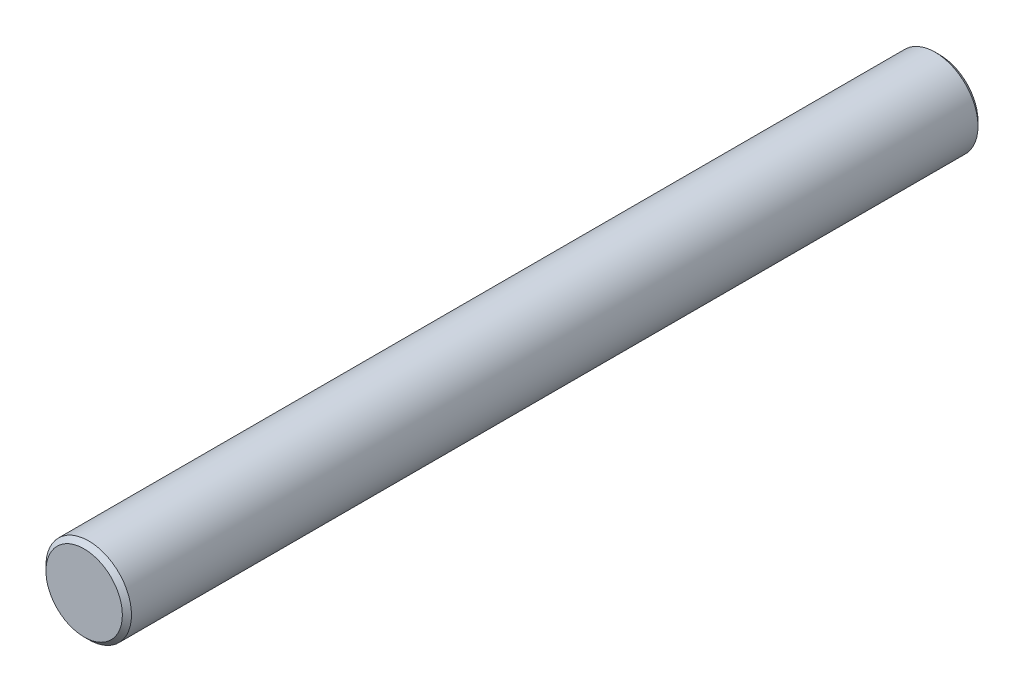
ISO-10303-21;
HEADER;
FILE_DESCRIPTION(('STEP AP214'),'2;1');
FILE_NAME('part.step','',(''),(''),'','','');
FILE_SCHEMA(('AUTOMOTIVE_DESIGN { 1 0 10303 214 1 1 1 1 }'));
ENDSEC;
DATA;
#1=APPLICATION_CONTEXT('core data for automotive mechanical design processes');
#2=APPLICATION_PROTOCOL_DEFINITION('international standard','automotive_design',2000,#1);
#3=PRODUCT_CONTEXT('',#1,'mechanical');
#4=PRODUCT('Part','Part','',(#3));
#5=PRODUCT_RELATED_PRODUCT_CATEGORY('part','',(#4));
#6=PRODUCT_DEFINITION_FORMATION('','',#4);
#7=PRODUCT_DEFINITION_CONTEXT('part definition',#1,'design');
#8=PRODUCT_DEFINITION('design','',#6,#7);
#9=PRODUCT_DEFINITION_SHAPE('','',#8);
#10=(LENGTH_UNIT() NAMED_UNIT(*) SI_UNIT(.MILLI.,.METRE.));
#11=(NAMED_UNIT(*) PLANE_ANGLE_UNIT() SI_UNIT($,.RADIAN.));
#12=(NAMED_UNIT(*) SI_UNIT($,.STERADIAN.) SOLID_ANGLE_UNIT());
#13=UNCERTAINTY_MEASURE_WITH_UNIT(LENGTH_MEASURE(1.E-05),#10,'distance_accuracy_value','');
#14=(GEOMETRIC_REPRESENTATION_CONTEXT(3) GLOBAL_UNCERTAINTY_ASSIGNED_CONTEXT((#13)) GLOBAL_UNIT_ASSIGNED_CONTEXT((#10,
#11,#12)) REPRESENTATION_CONTEXT('',''));
#15=CARTESIAN_POINT('',(0.,0.,0.));
#16=DIRECTION('',(0.,0.,1.));
#17=DIRECTION('',(1.,0.,0.));
#18=AXIS2_PLACEMENT_3D('',#15,#16,#17);
#19=CARTESIAN_POINT('',(0.,0.,95.25));
#20=DIRECTION('',(0.,0.,-1.));
#21=DIRECTION('',(-1.,0.,0.));
#22=AXIS2_PLACEMENT_3D('',#19,#20,#21);
#23=CYLINDRICAL_SURFACE('',#22,4.7625);
#24=CARTESIAN_POINT('',(0.,0.,0.508000000000022));
#25=DIRECTION('',(0.,0.,1.));
#26=DIRECTION('',(1.,0.,0.));
#27=AXIS2_PLACEMENT_3D('',#24,#25,#26);
#28=CIRCLE('',#27,4.7625);
#29=CARTESIAN_POINT('',(4.7625,0.,0.508000000000022));
#30=VERTEX_POINT('',#29);
#31=EDGE_CURVE('E44',#30,#30,#28,.T.);
#32=ORIENTED_EDGE('',*,*,#31,.T.);
#33=EDGE_LOOP('',(#32));
#34=FACE_BOUND('',#33,.T.);
#35=CARTESIAN_POINT('',(0.,0.,94.742));
#36=DIRECTION('',(0.,0.,1.));
#37=DIRECTION('',(1.,0.,0.));
#38=AXIS2_PLACEMENT_3D('',#35,#36,#37);
#39=CIRCLE('',#38,4.7625);
#40=CARTESIAN_POINT('',(4.7625,0.,94.742));
#41=VERTEX_POINT('',#40);
#42=EDGE_CURVE('E48',#41,#41,#39,.F.);
#43=ORIENTED_EDGE('',*,*,#42,.T.);
#44=EDGE_LOOP('',(#43));
#45=FACE_BOUND('',#44,.T.);
#46=ADVANCED_FACE('F32',(#34,#45),#23,.T.);
#47=CARTESIAN_POINT('',(0.,0.,95.25));
#48=DIRECTION('',(0.,0.,1.));
#49=DIRECTION('',(1.,0.,0.));
#50=AXIS2_PLACEMENT_3D('',#47,#48,#49);
#51=PLANE('',#50);
#52=CARTESIAN_POINT('',(0.,0.,95.25));
#53=DIRECTION('',(0.,0.,1.));
#54=DIRECTION('',(1.,0.,0.));
#55=AXIS2_PLACEMENT_3D('',#52,#53,#54);
#56=CIRCLE('',#55,4.25450000000001);
#57=CARTESIAN_POINT('',(4.25450000000001,0.,95.25));
#58=VERTEX_POINT('',#57);
#59=EDGE_CURVE('E10',#58,#58,#56,.T.);
#60=ORIENTED_EDGE('',*,*,#59,.T.);
#61=EDGE_LOOP('',(#60));
#62=FACE_BOUND('',#61,.T.);
#63=ADVANCED_FACE('F64',(#62),#51,.T.);
#64=CARTESIAN_POINT('',(0.,0.,0.));
#65=DIRECTION('',(0.,0.,1.));
#66=DIRECTION('',(1.,0.,0.));
#67=AXIS2_PLACEMENT_3D('',#64,#65,#66);
#68=PLANE('',#67);
#69=CARTESIAN_POINT('',(0.,0.,0.));
#70=DIRECTION('',(0.,0.,1.));
#71=DIRECTION('',(1.,0.,0.));
#72=AXIS2_PLACEMENT_3D('',#69,#70,#71);
#73=CIRCLE('',#72,4.25449999999998);
#74=CARTESIAN_POINT('',(4.25449999999998,0.,0.));
#75=VERTEX_POINT('',#74);
#76=EDGE_CURVE('E40',#75,#75,#73,.F.);
#77=ORIENTED_EDGE('',*,*,#76,.T.);
#78=EDGE_LOOP('',(#77));
#79=FACE_BOUND('',#78,.T.);
#80=ADVANCED_FACE('F61',(#79),#68,.F.);
#81=CARTESIAN_POINT('',(0.,0.,0.508000000000022));
#82=DIRECTION('',(0.,0.,1.));
#83=DIRECTION('',(1.,0.,0.));
#84=AXIS2_PLACEMENT_3D('',#81,#82,#83);
#85=CONICAL_SURFACE('',#84,4.7625,0.785398163397445);
#86=ORIENTED_EDGE('',*,*,#76,.F.);
#87=EDGE_LOOP('',(#86));
#88=FACE_BOUND('',#87,.T.);
#89=ORIENTED_EDGE('',*,*,#31,.F.);
#90=EDGE_LOOP('',(#89));
#91=FACE_BOUND('',#90,.T.);
#92=ADVANCED_FACE('F57',(#88,#91),#85,.T.);
#93=CARTESIAN_POINT('',(0.,0.,95.25));
#94=DIRECTION('',(0.,0.,-1.));
#95=DIRECTION('',(-1.,0.,0.));
#96=AXIS2_PLACEMENT_3D('',#93,#94,#95);
#97=CONICAL_SURFACE('',#96,4.25450000000001,0.785398163397445);
#98=ORIENTED_EDGE('',*,*,#42,.F.);
#99=EDGE_LOOP('',(#98));
#100=FACE_BOUND('',#99,.T.);
#101=ORIENTED_EDGE('',*,*,#59,.F.);
#102=EDGE_LOOP('',(#101));
#103=FACE_BOUND('',#102,.T.);
#104=ADVANCED_FACE('F35',(#100,#103),#97,.T.);
#105=CLOSED_SHELL('',(#46,#63,#80,#92,#104));
#106=MANIFOLD_SOLID_BREP('B2',#105);
#107=ADVANCED_BREP_SHAPE_REPRESENTATION('',(#18,#106),#14);
#108=SHAPE_DEFINITION_REPRESENTATION(#9,#107);
ENDSEC;
END-ISO-10303-21;
